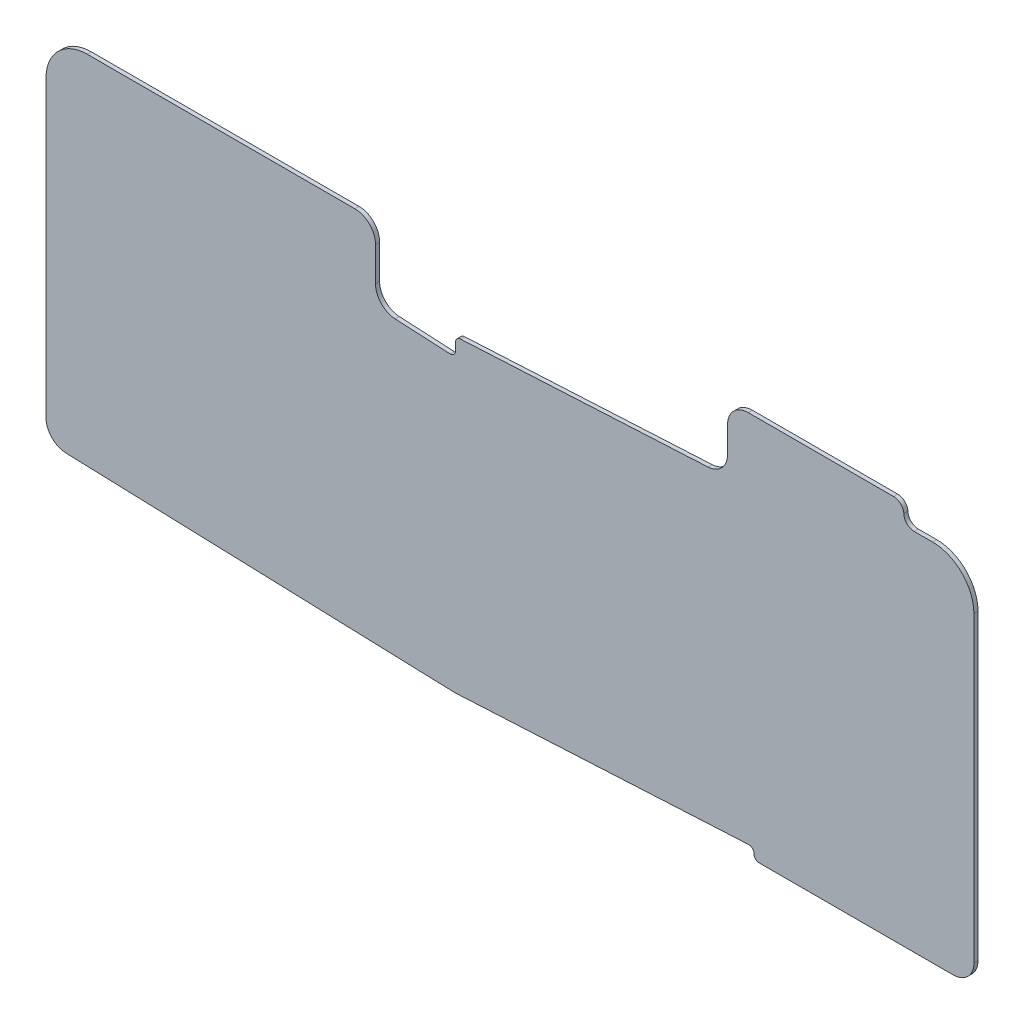
ISO-10303-21;
HEADER;
FILE_DESCRIPTION(('STEP AP214'),'2;1');
FILE_NAME('part.step','',(''),(''),'','','');
FILE_SCHEMA(('AUTOMOTIVE_DESIGN { 1 0 10303 214 1 1 1 1 }'));
ENDSEC;
DATA;
#1=APPLICATION_CONTEXT('core data for automotive mechanical design processes');
#2=APPLICATION_PROTOCOL_DEFINITION('international standard','automotive_design',2000,#1);
#3=PRODUCT_CONTEXT('',#1,'mechanical');
#4=PRODUCT('Part','Part','',(#3));
#5=PRODUCT_RELATED_PRODUCT_CATEGORY('part','',(#4));
#6=PRODUCT_DEFINITION_FORMATION('','',#4);
#7=PRODUCT_DEFINITION_CONTEXT('part definition',#1,'design');
#8=PRODUCT_DEFINITION('design','',#6,#7);
#9=PRODUCT_DEFINITION_SHAPE('','',#8);
#10=(LENGTH_UNIT() NAMED_UNIT(*) SI_UNIT(.MILLI.,.METRE.));
#11=(NAMED_UNIT(*) PLANE_ANGLE_UNIT() SI_UNIT($,.RADIAN.));
#12=(NAMED_UNIT(*) SI_UNIT($,.STERADIAN.) SOLID_ANGLE_UNIT());
#13=UNCERTAINTY_MEASURE_WITH_UNIT(LENGTH_MEASURE(1.E-05),#10,'distance_accuracy_value','');
#14=(GEOMETRIC_REPRESENTATION_CONTEXT(3) GLOBAL_UNCERTAINTY_ASSIGNED_CONTEXT((#13)) GLOBAL_UNIT_ASSIGNED_CONTEXT((#10,
#11,#12)) REPRESENTATION_CONTEXT('',''));
#15=CARTESIAN_POINT('',(0.,0.,0.));
#16=DIRECTION('',(0.,0.,1.));
#17=DIRECTION('',(1.,0.,0.));
#18=AXIS2_PLACEMENT_3D('',#15,#16,#17);
#19=CARTESIAN_POINT('',(-142.754433684428,110.187089821095,1.6));
#20=DIRECTION('',(0.,0.,-1.));
#21=DIRECTION('',(-1.,0.,0.));
#22=AXIS2_PLACEMENT_3D('',#19,#20,#21);
#23=CYLINDRICAL_SURFACE('',#22,16.);
#24=CARTESIAN_POINT('',(-142.754433684428,110.187089821095,0.));
#25=DIRECTION('',(0.,0.,1.));
#26=DIRECTION('',(1.,0.,0.));
#27=AXIS2_PLACEMENT_3D('',#24,#25,#26);
#28=CIRCLE('',#27,16.);
#29=CARTESIAN_POINT('',(-142.754433684428,126.187089821095,0.));
#30=VERTEX_POINT('',#29);
#31=CARTESIAN_POINT('',(-158.754433684428,110.187089821095,0.));
#32=VERTEX_POINT('',#31);
#33=EDGE_CURVE('E261',#30,#32,#28,.T.);
#34=ORIENTED_EDGE('',*,*,#33,.T.);
#35=DIRECTION('',(0.,0.,-1.));
#36=VECTOR('',#35,1.);
#37=CARTESIAN_POINT('',(-158.754433684428,110.187089821095,1.6));
#38=LINE('',#37,#36);
#39=CARTESIAN_POINT('',(-158.754433684428,110.187089821095,1.6));
#40=VERTEX_POINT('',#39);
#41=EDGE_CURVE('E11',#40,#32,#38,.T.);
#42=ORIENTED_EDGE('',*,*,#41,.F.);
#43=CARTESIAN_POINT('',(-142.754433684428,110.187089821095,1.6));
#44=DIRECTION('',(0.,0.,1.));
#45=DIRECTION('',(1.,0.,0.));
#46=AXIS2_PLACEMENT_3D('',#43,#44,#45);
#47=CIRCLE('',#46,16.);
#48=CARTESIAN_POINT('',(-142.754433684428,126.187089821095,1.6));
#49=VERTEX_POINT('',#48);
#50=EDGE_CURVE('E320',#49,#40,#47,.T.);
#51=ORIENTED_EDGE('',*,*,#50,.F.);
#52=DIRECTION('',(0.,0.,-1.));
#53=VECTOR('',#52,1.);
#54=CARTESIAN_POINT('',(-142.754433684428,126.187089821095,1.6));
#55=LINE('',#54,#53);
#56=EDGE_CURVE('E257',#49,#30,#55,.T.);
#57=ORIENTED_EDGE('',*,*,#56,.T.);
#58=EDGE_LOOP('',(#34,#42,#51,#57));
#59=FACE_BOUND('',#58,.T.);
#60=ADVANCED_FACE('F33',(#59),#23,.T.);
#61=CARTESIAN_POINT('',(-158.754433684428,-3.86594712239483,1.6));
#62=DIRECTION('',(1.,0.,0.));
#63=DIRECTION('',(0.,0.,-1.));
#64=AXIS2_PLACEMENT_3D('',#61,#62,#63);
#65=PLANE('',#64);
#66=DIRECTION('',(0.,-1.,0.));
#67=VECTOR('',#66,1.);
#68=CARTESIAN_POINT('',(-158.754433684428,-3.86594712239483,0.));
#69=LINE('',#68,#67);
#70=CARTESIAN_POINT('',(-158.754433684428,-3.86594712239483,0.));
#71=VERTEX_POINT('',#70);
#72=EDGE_CURVE('E264',#32,#71,#69,.T.);
#73=ORIENTED_EDGE('',*,*,#72,.T.);
#74=DIRECTION('',(0.,0.,-1.));
#75=VECTOR('',#74,1.);
#76=CARTESIAN_POINT('',(-158.754433684428,-3.86594712239483,1.6));
#77=LINE('',#76,#75);
#78=CARTESIAN_POINT('',(-158.754433684428,-3.86594712239483,1.6));
#79=VERTEX_POINT('',#78);
#80=EDGE_CURVE('E41',#79,#71,#77,.T.);
#81=ORIENTED_EDGE('',*,*,#80,.F.);
#82=DIRECTION('',(0.,-1.,0.));
#83=VECTOR('',#82,1.);
#84=CARTESIAN_POINT('',(-158.754433684428,95.6798603196686,1.6));
#85=LINE('',#84,#83);
#86=EDGE_CURVE('E158',#40,#79,#85,.T.);
#87=ORIENTED_EDGE('',*,*,#86,.F.);
#88=ORIENTED_EDGE('',*,*,#41,.T.);
#89=EDGE_LOOP('',(#73,#81,#87,#88));
#90=FACE_BOUND('',#89,.T.);
#91=ADVANCED_FACE('F488',(#90),#65,.F.);
#92=CARTESIAN_POINT('',(-150.754433684427,-3.86594712239483,1.6));
#93=DIRECTION('',(0.,0.,-1.));
#94=DIRECTION('',(-1.,0.,0.));
#95=AXIS2_PLACEMENT_3D('',#92,#93,#94);
#96=CYLINDRICAL_SURFACE('',#95,8.00000000000003);
#97=CARTESIAN_POINT('',(-150.754433684427,-3.86594712239483,0.));
#98=DIRECTION('',(0.,0.,1.));
#99=DIRECTION('',(1.,0.,0.));
#100=AXIS2_PLACEMENT_3D('',#97,#98,#99);
#101=CIRCLE('',#100,8.00000000000003);
#102=CARTESIAN_POINT('',(-151.023233988295,-11.8614299969085,0.));
#103=VERTEX_POINT('',#102);
#104=EDGE_CURVE('E266',#71,#103,#101,.T.);
#105=ORIENTED_EDGE('',*,*,#104,.T.);
#106=DIRECTION('',(0.,0.,-1.));
#107=VECTOR('',#106,1.);
#108=CARTESIAN_POINT('',(-151.023233988295,-11.8614299969085,1.6));
#109=LINE('',#108,#107);
#110=CARTESIAN_POINT('',(-151.023233988295,-11.8614299969085,1.6));
#111=VERTEX_POINT('',#110);
#112=EDGE_CURVE('E393',#111,#103,#109,.T.);
#113=ORIENTED_EDGE('',*,*,#112,.F.);
#114=CARTESIAN_POINT('',(-150.754433684427,-3.86594712239483,1.6));
#115=DIRECTION('',(0.,0.,1.));
#116=DIRECTION('',(1.,0.,0.));
#117=AXIS2_PLACEMENT_3D('',#114,#115,#116);
#118=CIRCLE('',#117,8.00000000000003);
#119=EDGE_CURVE('E401',#79,#111,#118,.T.);
#120=ORIENTED_EDGE('',*,*,#119,.F.);
#121=ORIENTED_EDGE('',*,*,#80,.T.);
#122=EDGE_LOOP('',(#105,#113,#120,#121));
#123=FACE_BOUND('',#122,.T.);
#124=ADVANCED_FACE('F399',(#123),#96,.T.);
#125=CARTESIAN_POINT('',(-1.21955829942181,-16.8976828633825,1.6));
#126=DIRECTION('',(0.0336000379834171,0.999435359314204,0.));
#127=DIRECTION('',(-0.999435359314204,0.0336000379834171,0.));
#128=AXIS2_PLACEMENT_3D('',#125,#126,#127);
#129=PLANE('',#128);
#130=DIRECTION('',(0.999435359314205,-0.0336000379834171,0.));
#131=VECTOR('',#130,1.);
#132=CARTESIAN_POINT('',(-1.21955829942181,-16.8976828633825,0.));
#133=LINE('',#132,#131);
#134=CARTESIAN_POINT('',(-1.21955829942181,-16.8976828633825,0.));
#135=VERTEX_POINT('',#134);
#136=EDGE_CURVE('E268',#103,#135,#133,.T.);
#137=ORIENTED_EDGE('',*,*,#136,.T.);
#138=DIRECTION('',(0.,0.,-1.));
#139=VECTOR('',#138,1.);
#140=CARTESIAN_POINT('',(-1.21955829942181,-16.8976828633825,1.6));
#141=LINE('',#140,#139);
#142=CARTESIAN_POINT('',(-1.21955829942181,-16.8976828633825,1.6));
#143=VERTEX_POINT('',#142);
#144=EDGE_CURVE('E390',#143,#135,#141,.T.);
#145=ORIENTED_EDGE('',*,*,#144,.F.);
#146=DIRECTION('',(0.999435359314205,-0.0336000379834171,0.));
#147=VECTOR('',#146,1.);
#148=CARTESIAN_POINT('',(-1.21955829942181,-16.8976828633825,1.6));
#149=LINE('',#148,#147);
#150=EDGE_CURVE('E419',#111,#143,#149,.T.);
#151=ORIENTED_EDGE('',*,*,#150,.F.);
#152=ORIENTED_EDGE('',*,*,#112,.T.);
#153=EDGE_LOOP('',(#137,#145,#151,#152));
#154=FACE_BOUND('',#153,.T.);
#155=ADVANCED_FACE('F410',(#154),#129,.F.);
#156=CARTESIAN_POINT('',(-0.379557349835993,8.08820111947182,1.6));
#157=DIRECTION('',(0.,0.,-1.));
#158=DIRECTION('',(-1.,0.,0.));
#159=AXIS2_PLACEMENT_3D('',#156,#157,#158);
#160=CYLINDRICAL_SURFACE('',#159,24.9999999999992);
#161=CARTESIAN_POINT('',(-0.379557349835993,8.08820111947182,0.));
#162=DIRECTION('',(0.,0.,1.));
#163=DIRECTION('',(1.,0.,0.));
#164=AXIS2_PLACEMENT_3D('',#161,#162,#163);
#165=CIRCLE('',#164,24.9999999999992);
#166=CARTESIAN_POINT('',(0.928841556237103,-16.8775372493918,0.));
#167=VERTEX_POINT('',#166);
#168=EDGE_CURVE('E270',#135,#167,#165,.T.);
#169=ORIENTED_EDGE('',*,*,#168,.T.);
#170=DIRECTION('',(0.,0.,-1.));
#171=VECTOR('',#170,1.);
#172=CARTESIAN_POINT('',(0.928841556237103,-16.8775372493918,1.6));
#173=LINE('',#172,#171);
#174=CARTESIAN_POINT('',(0.928841556237103,-16.8775372493918,1.6));
#175=VERTEX_POINT('',#174);
#176=EDGE_CURVE('E387',#175,#167,#173,.T.);
#177=ORIENTED_EDGE('',*,*,#176,.F.);
#178=CARTESIAN_POINT('',(-0.379557349835993,8.08820111947182,1.6));
#179=DIRECTION('',(0.,0.,1.));
#180=DIRECTION('',(1.,0.,0.));
#181=AXIS2_PLACEMENT_3D('',#178,#179,#180);
#182=CIRCLE('',#181,24.9999999999992);
#183=EDGE_CURVE('E416',#143,#175,#182,.T.);
#184=ORIENTED_EDGE('',*,*,#183,.F.);
#185=ORIENTED_EDGE('',*,*,#144,.T.);
#186=EDGE_LOOP('',(#169,#177,#184,#185));
#187=FACE_BOUND('',#186,.T.);
#188=ADVANCED_FACE('F414',(#187),#160,.T.);
#189=CARTESIAN_POINT('',(113.646118630477,-10.9702750710999,1.6));
#190=DIRECTION('',(-0.0523359562429408,0.998629534754574,0.));
#191=DIRECTION('',(-0.998629534754574,-0.0523359562429408,0.));
#192=AXIS2_PLACEMENT_3D('',#189,#190,#191);
#193=PLANE('',#192);
#194=DIRECTION('',(0.998629534754574,0.0523359562429408,0.));
#195=VECTOR('',#194,1.);
#196=CARTESIAN_POINT('',(113.646118630477,-10.9702750710999,0.));
#197=LINE('',#196,#195);
#198=CARTESIAN_POINT('',(113.646118630477,-10.9702750710999,0.));
#199=VERTEX_POINT('',#198);
#200=EDGE_CURVE('E272',#167,#199,#197,.T.);
#201=ORIENTED_EDGE('',*,*,#200,.T.);
#202=DIRECTION('',(0.,0.,-1.));
#203=VECTOR('',#202,1.);
#204=CARTESIAN_POINT('',(113.646118630477,-10.9702750710999,1.6));
#205=LINE('',#204,#203);
#206=CARTESIAN_POINT('',(113.646118630477,-10.9702750710999,1.6));
#207=VERTEX_POINT('',#206);
#208=EDGE_CURVE('E384',#207,#199,#205,.T.);
#209=ORIENTED_EDGE('',*,*,#208,.F.);
#210=DIRECTION('',(0.998629534754574,0.0523359562429408,0.));
#211=VECTOR('',#210,1.);
#212=CARTESIAN_POINT('',(113.646118630477,-10.9702750710999,1.6));
#213=LINE('',#212,#211);
#214=EDGE_CURVE('E418',#175,#207,#213,.T.);
#215=ORIENTED_EDGE('',*,*,#214,.F.);
#216=ORIENTED_EDGE('',*,*,#176,.T.);
#217=EDGE_LOOP('',(#201,#209,#215,#216));
#218=FACE_BOUND('',#217,.T.);
#219=ADVANCED_FACE('F501',(#218),#193,.F.);
#220=CARTESIAN_POINT('',(113.750790542963,-12.9675341406091,1.6));
#221=DIRECTION('',(0.,0.,-1.));
#222=DIRECTION('',(-1.,0.,0.));
#223=AXIS2_PLACEMENT_3D('',#220,#221,#222);
#224=CYLINDRICAL_SURFACE('',#223,1.99999999999997);
#225=CARTESIAN_POINT('',(113.750790542963,-12.9675341406091,0.));
#226=DIRECTION('',(0.,0.,-1.));
#227=DIRECTION('',(1.,0.,0.));
#228=AXIS2_PLACEMENT_3D('',#225,#226,#227);
#229=CIRCLE('',#228,1.99999999999997);
#230=CARTESIAN_POINT('',(115.750790542963,-12.967534140609,0.));
#231=VERTEX_POINT('',#230);
#232=EDGE_CURVE('E274',#199,#231,#229,.T.);
#233=ORIENTED_EDGE('',*,*,#232,.T.);
#234=DIRECTION('',(0.,0.,-1.));
#235=VECTOR('',#234,1.);
#236=CARTESIAN_POINT('',(115.750790542963,-12.967534140609,1.6));
#237=LINE('',#236,#235);
#238=CARTESIAN_POINT('',(115.750790542963,-12.967534140609,1.6));
#239=VERTEX_POINT('',#238);
#240=EDGE_CURVE('E381',#239,#231,#237,.T.);
#241=ORIENTED_EDGE('',*,*,#240,.F.);
#242=CARTESIAN_POINT('',(113.750790542963,-12.9675341406091,1.6));
#243=DIRECTION('',(0.,0.,-1.));
#244=DIRECTION('',(1.,0.,0.));
#245=AXIS2_PLACEMENT_3D('',#242,#243,#244);
#246=CIRCLE('',#245,1.99999999999997);
#247=EDGE_CURVE('E421',#207,#239,#246,.T.);
#248=ORIENTED_EDGE('',*,*,#247,.F.);
#249=ORIENTED_EDGE('',*,*,#208,.T.);
#250=EDGE_LOOP('',(#233,#241,#248,#249));
#251=FACE_BOUND('',#250,.T.);
#252=ADVANCED_FACE('F504',(#251),#224,.F.);
#253=CARTESIAN_POINT('',(115.750790542963,-13.0915973463914,1.6));
#254=DIRECTION('',(1.,0.,0.));
#255=DIRECTION('',(0.,0.,-1.));
#256=AXIS2_PLACEMENT_3D('',#253,#254,#255);
#257=PLANE('',#256);
#258=DIRECTION('',(0.,-1.,0.));
#259=VECTOR('',#258,1.);
#260=CARTESIAN_POINT('',(115.750790542963,-13.0915973463914,0.));
#261=LINE('',#260,#259);
#262=CARTESIAN_POINT('',(115.750790542963,-13.0915973463914,0.));
#263=VERTEX_POINT('',#262);
#264=EDGE_CURVE('E276',#231,#263,#261,.T.);
#265=ORIENTED_EDGE('',*,*,#264,.T.);
#266=DIRECTION('',(0.,0.,-1.));
#267=VECTOR('',#266,1.);
#268=CARTESIAN_POINT('',(115.750790542963,-13.0915973463914,1.6));
#269=LINE('',#268,#267);
#270=CARTESIAN_POINT('',(115.750790542963,-13.0915973463914,1.6));
#271=VERTEX_POINT('',#270);
#272=EDGE_CURVE('E378',#271,#263,#269,.T.);
#273=ORIENTED_EDGE('',*,*,#272,.F.);
#274=DIRECTION('',(0.,-1.,0.));
#275=VECTOR('',#274,1.);
#276=CARTESIAN_POINT('',(115.750790542963,-13.0915973463914,1.6));
#277=LINE('',#276,#275);
#278=EDGE_CURVE('E427',#239,#271,#277,.T.);
#279=ORIENTED_EDGE('',*,*,#278,.F.);
#280=ORIENTED_EDGE('',*,*,#240,.T.);
#281=EDGE_LOOP('',(#265,#273,#279,#280));
#282=FACE_BOUND('',#281,.T.);
#283=ADVANCED_FACE('F508',(#282),#257,.F.);
#284=CARTESIAN_POINT('',(117.750790542963,-13.0915973463914,1.6));
#285=DIRECTION('',(0.,0.,-1.));
#286=DIRECTION('',(-1.,0.,0.));
#287=AXIS2_PLACEMENT_3D('',#284,#285,#286);
#288=CYLINDRICAL_SURFACE('',#287,2.00000000000005);
#289=CARTESIAN_POINT('',(117.750790542963,-13.0915973463914,0.));
#290=DIRECTION('',(0.,0.,1.));
#291=DIRECTION('',(1.,0.,0.));
#292=AXIS2_PLACEMENT_3D('',#289,#290,#291);
#293=CIRCLE('',#292,2.00000000000005);
#294=CARTESIAN_POINT('',(117.750790542963,-15.0915973463914,0.));
#295=VERTEX_POINT('',#294);
#296=EDGE_CURVE('E278',#263,#295,#293,.T.);
#297=ORIENTED_EDGE('',*,*,#296,.T.);
#298=DIRECTION('',(0.,0.,-1.));
#299=VECTOR('',#298,1.);
#300=CARTESIAN_POINT('',(117.750790542963,-15.0915973463914,1.6));
#301=LINE('',#300,#299);
#302=CARTESIAN_POINT('',(117.750790542963,-15.0915973463914,1.6));
#303=VERTEX_POINT('',#302);
#304=EDGE_CURVE('E375',#303,#295,#301,.T.);
#305=ORIENTED_EDGE('',*,*,#304,.F.);
#306=CARTESIAN_POINT('',(117.750790542963,-13.0915973463914,1.6));
#307=DIRECTION('',(0.,0.,1.));
#308=DIRECTION('',(1.,0.,0.));
#309=AXIS2_PLACEMENT_3D('',#306,#307,#308);
#310=CIRCLE('',#309,2.00000000000005);
#311=EDGE_CURVE('E429',#271,#303,#310,.T.);
#312=ORIENTED_EDGE('',*,*,#311,.F.);
#313=ORIENTED_EDGE('',*,*,#272,.T.);
#314=EDGE_LOOP('',(#297,#305,#312,#313));
#315=FACE_BOUND('',#314,.T.);
#316=ADVANCED_FACE('F512',(#315),#288,.T.);
#317=CARTESIAN_POINT('',(193.,-15.0915973463915,1.6));
#318=DIRECTION('',(0.,1.,0.));
#319=DIRECTION('',(-1.,0.,0.));
#320=AXIS2_PLACEMENT_3D('',#317,#318,#319);
#321=PLANE('',#320);
#322=DIRECTION('',(1.,0.,0.));
#323=VECTOR('',#322,1.);
#324=CARTESIAN_POINT('',(193.,-15.0915973463915,0.));
#325=LINE('',#324,#323);
#326=CARTESIAN_POINT('',(193.,-15.0915973463915,0.));
#327=VERTEX_POINT('',#326);
#328=EDGE_CURVE('E280',#295,#327,#325,.T.);
#329=ORIENTED_EDGE('',*,*,#328,.T.);
#330=DIRECTION('',(0.,0.,-1.));
#331=VECTOR('',#330,1.);
#332=CARTESIAN_POINT('',(193.,-15.0915973463915,1.6));
#333=LINE('',#332,#331);
#334=CARTESIAN_POINT('',(193.,-15.0915973463915,1.6));
#335=VERTEX_POINT('',#334);
#336=EDGE_CURVE('E372',#335,#327,#333,.T.);
#337=ORIENTED_EDGE('',*,*,#336,.F.);
#338=DIRECTION('',(1.,0.,0.));
#339=VECTOR('',#338,1.);
#340=CARTESIAN_POINT('',(193.,-15.0915973463915,1.6));
#341=LINE('',#340,#339);
#342=EDGE_CURVE('E431',#303,#335,#341,.T.);
#343=ORIENTED_EDGE('',*,*,#342,.F.);
#344=ORIENTED_EDGE('',*,*,#304,.T.);
#345=EDGE_LOOP('',(#329,#337,#343,#344));
#346=FACE_BOUND('',#345,.T.);
#347=ADVANCED_FACE('F516',(#346),#321,.F.);
#348=CARTESIAN_POINT('',(193.,-7.09159734639147,1.6));
#349=DIRECTION('',(0.,0.,-1.));
#350=DIRECTION('',(-1.,0.,0.));
#351=AXIS2_PLACEMENT_3D('',#348,#349,#350);
#352=CYLINDRICAL_SURFACE('',#351,8.00000000000005);
#353=CARTESIAN_POINT('',(193.,-7.09159734639147,0.));
#354=DIRECTION('',(0.,0.,1.));
#355=DIRECTION('',(1.,0.,0.));
#356=AXIS2_PLACEMENT_3D('',#353,#354,#355);
#357=CIRCLE('',#356,8.00000000000005);
#358=CARTESIAN_POINT('',(201.,-7.09159734639144,0.));
#359=VERTEX_POINT('',#358);
#360=EDGE_CURVE('E282',#327,#359,#357,.T.);
#361=ORIENTED_EDGE('',*,*,#360,.T.);
#362=DIRECTION('',(0.,0.,-1.));
#363=VECTOR('',#362,1.);
#364=CARTESIAN_POINT('',(201.,-7.09159734639144,1.6));
#365=LINE('',#364,#363);
#366=CARTESIAN_POINT('',(201.,-7.09159734639144,1.6));
#367=VERTEX_POINT('',#366);
#368=EDGE_CURVE('E369',#367,#359,#365,.T.);
#369=ORIENTED_EDGE('',*,*,#368,.F.);
#370=CARTESIAN_POINT('',(193.,-7.09159734639147,1.6));
#371=DIRECTION('',(0.,0.,1.));
#372=DIRECTION('',(1.,0.,0.));
#373=AXIS2_PLACEMENT_3D('',#370,#371,#372);
#374=CIRCLE('',#373,8.00000000000005);
#375=EDGE_CURVE('E433',#335,#367,#374,.T.);
#376=ORIENTED_EDGE('',*,*,#375,.F.);
#377=ORIENTED_EDGE('',*,*,#336,.T.);
#378=EDGE_LOOP('',(#361,#369,#376,#377));
#379=FACE_BOUND('',#378,.T.);
#380=ADVANCED_FACE('F520',(#379),#352,.T.);
#381=CARTESIAN_POINT('',(201.,97.8938566348198,1.6));
#382=DIRECTION('',(-1.,0.,0.));
#383=DIRECTION('',(0.,0.,1.));
#384=AXIS2_PLACEMENT_3D('',#381,#382,#383);
#385=PLANE('',#384);
#386=DIRECTION('',(0.,1.,0.));
#387=VECTOR('',#386,1.);
#388=CARTESIAN_POINT('',(201.,97.8938566348198,0.));
#389=LINE('',#388,#387);
#390=CARTESIAN_POINT('',(201.,110.27653598152,0.));
#391=VERTEX_POINT('',#390);
#392=EDGE_CURVE('E285',#359,#391,#389,.T.);
#393=ORIENTED_EDGE('',*,*,#392,.T.);
#394=DIRECTION('',(0.,0.,-1.));
#395=VECTOR('',#394,1.);
#396=CARTESIAN_POINT('',(201.,110.27653598152,1.6));
#397=LINE('',#396,#395);
#398=CARTESIAN_POINT('',(201.,110.27653598152,1.6));
#399=VERTEX_POINT('',#398);
#400=EDGE_CURVE('E366',#399,#391,#397,.T.);
#401=ORIENTED_EDGE('',*,*,#400,.F.);
#402=DIRECTION('',(0.,1.,0.));
#403=VECTOR('',#402,1.);
#404=CARTESIAN_POINT('',(201.,97.8938566348198,1.6));
#405=LINE('',#404,#403);
#406=EDGE_CURVE('E435',#367,#399,#405,.T.);
#407=ORIENTED_EDGE('',*,*,#406,.F.);
#408=ORIENTED_EDGE('',*,*,#368,.T.);
#409=EDGE_LOOP('',(#393,#401,#407,#408));
#410=FACE_BOUND('',#409,.T.);
#411=ADVANCED_FACE('F524',(#410),#385,.F.);
#412=CARTESIAN_POINT('',(185.,110.27653598152,1.6));
#413=DIRECTION('',(0.,0.,-1.));
#414=DIRECTION('',(-1.,0.,0.));
#415=AXIS2_PLACEMENT_3D('',#412,#413,#414);
#416=CYLINDRICAL_SURFACE('',#415,16.);
#417=CARTESIAN_POINT('',(185.,110.27653598152,0.));
#418=DIRECTION('',(0.,0.,1.));
#419=DIRECTION('',(1.,0.,0.));
#420=AXIS2_PLACEMENT_3D('',#417,#418,#419);
#421=CIRCLE('',#420,16.);
#422=CARTESIAN_POINT('',(185.,126.27653598152,0.));
#423=VERTEX_POINT('',#422);
#424=EDGE_CURVE('E287',#391,#423,#421,.T.);
#425=ORIENTED_EDGE('',*,*,#424,.T.);
#426=DIRECTION('',(0.,0.,-1.));
#427=VECTOR('',#426,1.);
#428=CARTESIAN_POINT('',(185.,126.27653598152,1.6));
#429=LINE('',#428,#427);
#430=CARTESIAN_POINT('',(185.,126.27653598152,1.6));
#431=VERTEX_POINT('',#430);
#432=EDGE_CURVE('E363',#431,#423,#429,.T.);
#433=ORIENTED_EDGE('',*,*,#432,.F.);
#434=CARTESIAN_POINT('',(185.,110.27653598152,1.6));
#435=DIRECTION('',(0.,0.,1.));
#436=DIRECTION('',(1.,0.,0.));
#437=AXIS2_PLACEMENT_3D('',#434,#435,#436);
#438=CIRCLE('',#437,16.);
#439=EDGE_CURVE('E437',#399,#431,#438,.T.);
#440=ORIENTED_EDGE('',*,*,#439,.F.);
#441=ORIENTED_EDGE('',*,*,#400,.T.);
#442=EDGE_LOOP('',(#425,#433,#440,#441));
#443=FACE_BOUND('',#442,.T.);
#444=ADVANCED_FACE('F528',(#443),#416,.T.);
#445=CARTESIAN_POINT('',(185.,126.27653598152,1.6));
#446=DIRECTION('',(0.,-1.,0.));
#447=DIRECTION('',(0.,0.,-1.));
#448=AXIS2_PLACEMENT_3D('',#445,#446,#447);
#449=PLANE('',#448);
#450=DIRECTION('',(-1.,0.,0.));
#451=VECTOR('',#450,1.);
#452=CARTESIAN_POINT('',(185.,126.27653598152,0.));
#453=LINE('',#452,#451);
#454=CARTESIAN_POINT('',(177.851790542964,126.27653598152,0.));
#455=VERTEX_POINT('',#454);
#456=EDGE_CURVE('E289',#423,#455,#453,.T.);
#457=ORIENTED_EDGE('',*,*,#456,.T.);
#458=DIRECTION('',(0.,0.,-1.));
#459=VECTOR('',#458,1.);
#460=CARTESIAN_POINT('',(177.851790542964,126.27653598152,1.6));
#461=LINE('',#460,#459);
#462=CARTESIAN_POINT('',(177.851790542964,126.27653598152,1.6));
#463=VERTEX_POINT('',#462);
#464=EDGE_CURVE('E360',#463,#455,#461,.T.);
#465=ORIENTED_EDGE('',*,*,#464,.F.);
#466=DIRECTION('',(-1.,0.,0.));
#467=VECTOR('',#466,1.);
#468=CARTESIAN_POINT('',(185.,126.27653598152,1.6));
#469=LINE('',#468,#467);
#470=EDGE_CURVE('E439',#431,#463,#469,.T.);
#471=ORIENTED_EDGE('',*,*,#470,.F.);
#472=ORIENTED_EDGE('',*,*,#432,.T.);
#473=EDGE_LOOP('',(#457,#465,#471,#472));
#474=FACE_BOUND('',#473,.T.);
#475=ADVANCED_FACE('F532',(#474),#449,.F.);
#476=CARTESIAN_POINT('',(177.851790542964,130.27653598152,1.6));
#477=DIRECTION('',(0.,0.,-1.));
#478=DIRECTION('',(-1.,0.,0.));
#479=AXIS2_PLACEMENT_3D('',#476,#477,#478);
#480=CYLINDRICAL_SURFACE('',#479,4.);
#481=CARTESIAN_POINT('',(177.851790542964,130.27653598152,0.));
#482=DIRECTION('',(0.,0.,-1.));
#483=DIRECTION('',(1.,0.,0.));
#484=AXIS2_PLACEMENT_3D('',#481,#482,#483);
#485=CIRCLE('',#484,4.);
#486=CARTESIAN_POINT('',(173.851790542964,130.27653598152,0.));
#487=VERTEX_POINT('',#486);
#488=EDGE_CURVE('E291',#455,#487,#485,.T.);
#489=ORIENTED_EDGE('',*,*,#488,.T.);
#490=DIRECTION('',(0.,0.,-1.));
#491=VECTOR('',#490,1.);
#492=CARTESIAN_POINT('',(173.851790542964,130.27653598152,1.6));
#493=LINE('',#492,#491);
#494=CARTESIAN_POINT('',(173.851790542964,130.27653598152,1.6));
#495=VERTEX_POINT('',#494);
#496=EDGE_CURVE('E357',#495,#487,#493,.T.);
#497=ORIENTED_EDGE('',*,*,#496,.F.);
#498=CARTESIAN_POINT('',(177.851790542964,130.27653598152,1.6));
#499=DIRECTION('',(0.,0.,-1.));
#500=DIRECTION('',(1.,0.,0.));
#501=AXIS2_PLACEMENT_3D('',#498,#499,#500);
#502=CIRCLE('',#501,4.);
#503=EDGE_CURVE('E441',#463,#495,#502,.T.);
#504=ORIENTED_EDGE('',*,*,#503,.F.);
#505=ORIENTED_EDGE('',*,*,#464,.T.);
#506=EDGE_LOOP('',(#489,#497,#504,#505));
#507=FACE_BOUND('',#506,.T.);
#508=ADVANCED_FACE('F536',(#507),#480,.F.);
#509=CARTESIAN_POINT('',(173.851790542964,130.,1.6));
#510=DIRECTION('',(1.,0.,0.));
#511=DIRECTION('',(0.,0.,-1.));
#512=AXIS2_PLACEMENT_3D('',#509,#510,#511);
#513=PLANE('',#512);
#514=DIRECTION('',(0.,-1.,0.));
#515=VECTOR('',#514,1.);
#516=CARTESIAN_POINT('',(173.851790542964,130.,0.));
#517=LINE('',#516,#515);
#518=CARTESIAN_POINT('',(173.851790542964,130.,0.));
#519=VERTEX_POINT('',#518);
#520=EDGE_CURVE('E293',#487,#519,#517,.T.);
#521=ORIENTED_EDGE('',*,*,#520,.T.);
#522=DIRECTION('',(0.,0.,-1.));
#523=VECTOR('',#522,1.);
#524=CARTESIAN_POINT('',(173.851790542964,130.,1.6));
#525=LINE('',#524,#523);
#526=CARTESIAN_POINT('',(173.851790542964,130.,1.6));
#527=VERTEX_POINT('',#526);
#528=EDGE_CURVE('E354',#527,#519,#525,.T.);
#529=ORIENTED_EDGE('',*,*,#528,.F.);
#530=DIRECTION('',(0.,-1.,0.));
#531=VECTOR('',#530,1.);
#532=CARTESIAN_POINT('',(173.851790542964,130.,1.6));
#533=LINE('',#532,#531);
#534=EDGE_CURVE('E443',#495,#527,#533,.T.);
#535=ORIENTED_EDGE('',*,*,#534,.F.);
#536=ORIENTED_EDGE('',*,*,#496,.T.);
#537=EDGE_LOOP('',(#521,#529,#535,#536));
#538=FACE_BOUND('',#537,.T.);
#539=ADVANCED_FACE('F540',(#538),#513,.F.);
#540=CARTESIAN_POINT('',(169.851790542964,130.,1.6));
#541=DIRECTION('',(0.,0.,-1.));
#542=DIRECTION('',(-1.,0.,0.));
#543=AXIS2_PLACEMENT_3D('',#540,#541,#542);
#544=CYLINDRICAL_SURFACE('',#543,4.);
#545=CARTESIAN_POINT('',(169.851790542964,130.,0.));
#546=DIRECTION('',(0.,0.,1.));
#547=DIRECTION('',(1.,0.,0.));
#548=AXIS2_PLACEMENT_3D('',#545,#546,#547);
#549=CIRCLE('',#548,4.);
#550=CARTESIAN_POINT('',(169.851790542964,134.,0.));
#551=VERTEX_POINT('',#550);
#552=EDGE_CURVE('E295',#519,#551,#549,.T.);
#553=ORIENTED_EDGE('',*,*,#552,.T.);
#554=DIRECTION('',(0.,0.,-1.));
#555=VECTOR('',#554,1.);
#556=CARTESIAN_POINT('',(169.851790542964,134.,1.6));
#557=LINE('',#556,#555);
#558=CARTESIAN_POINT('',(169.851790542964,134.,1.6));
#559=VERTEX_POINT('',#558);
#560=EDGE_CURVE('E351',#559,#551,#557,.T.);
#561=ORIENTED_EDGE('',*,*,#560,.F.);
#562=CARTESIAN_POINT('',(169.851790542964,130.,1.6));
#563=DIRECTION('',(0.,0.,1.));
#564=DIRECTION('',(1.,0.,0.));
#565=AXIS2_PLACEMENT_3D('',#562,#563,#564);
#566=CIRCLE('',#565,4.);
#567=EDGE_CURVE('E445',#527,#559,#566,.T.);
#568=ORIENTED_EDGE('',*,*,#567,.F.);
#569=ORIENTED_EDGE('',*,*,#528,.T.);
#570=EDGE_LOOP('',(#553,#561,#568,#569));
#571=FACE_BOUND('',#570,.T.);
#572=ADVANCED_FACE('F544',(#571),#544,.T.);
#573=CARTESIAN_POINT('',(169.851790542964,134.,1.6));
#574=DIRECTION('',(0.,-1.,0.));
#575=DIRECTION('',(1.,0.,0.));
#576=AXIS2_PLACEMENT_3D('',#573,#574,#575);
#577=PLANE('',#576);
#578=DIRECTION('',(-1.,0.,0.));
#579=VECTOR('',#578,1.);
#580=CARTESIAN_POINT('',(169.851790542964,134.,0.));
#581=LINE('',#580,#579);
#582=CARTESIAN_POINT('',(113.5,134.,0.));
#583=VERTEX_POINT('',#582);
#584=EDGE_CURVE('E297',#551,#583,#581,.T.);
#585=ORIENTED_EDGE('',*,*,#584,.T.);
#586=DIRECTION('',(0.,0.,-1.));
#587=VECTOR('',#586,1.);
#588=CARTESIAN_POINT('',(113.5,134.,1.6));
#589=LINE('',#588,#587);
#590=CARTESIAN_POINT('',(113.5,134.,1.6));
#591=VERTEX_POINT('',#590);
#592=EDGE_CURVE('E348',#591,#583,#589,.T.);
#593=ORIENTED_EDGE('',*,*,#592,.F.);
#594=DIRECTION('',(-1.,0.,0.));
#595=VECTOR('',#594,1.);
#596=CARTESIAN_POINT('',(169.851790542964,134.,1.6));
#597=LINE('',#596,#595);
#598=EDGE_CURVE('E447',#559,#591,#597,.T.);
#599=ORIENTED_EDGE('',*,*,#598,.F.);
#600=ORIENTED_EDGE('',*,*,#560,.T.);
#601=EDGE_LOOP('',(#585,#593,#599,#600));
#602=FACE_BOUND('',#601,.T.);
#603=ADVANCED_FACE('F548',(#602),#577,.F.);
#604=CARTESIAN_POINT('',(113.5,126.,1.6));
#605=DIRECTION('',(0.,0.,-1.));
#606=DIRECTION('',(-1.,0.,0.));
#607=AXIS2_PLACEMENT_3D('',#604,#605,#606);
#608=CYLINDRICAL_SURFACE('',#607,8.00000000000001);
#609=CARTESIAN_POINT('',(113.5,126.,0.));
#610=DIRECTION('',(0.,0.,1.));
#611=DIRECTION('',(1.,0.,0.));
#612=AXIS2_PLACEMENT_3D('',#609,#610,#611);
#613=CIRCLE('',#612,8.00000000000001);
#614=CARTESIAN_POINT('',(105.5,126.,0.));
#615=VERTEX_POINT('',#614);
#616=EDGE_CURVE('E299',#583,#615,#613,.T.);
#617=ORIENTED_EDGE('',*,*,#616,.T.);
#618=DIRECTION('',(0.,0.,-1.));
#619=VECTOR('',#618,1.);
#620=CARTESIAN_POINT('',(105.5,126.,1.6));
#621=LINE('',#620,#619);
#622=CARTESIAN_POINT('',(105.5,126.,1.6));
#623=VERTEX_POINT('',#622);
#624=EDGE_CURVE('E345',#623,#615,#621,.T.);
#625=ORIENTED_EDGE('',*,*,#624,.F.);
#626=CARTESIAN_POINT('',(113.5,126.,1.6));
#627=DIRECTION('',(0.,0.,1.));
#628=DIRECTION('',(1.,0.,0.));
#629=AXIS2_PLACEMENT_3D('',#626,#627,#628);
#630=CIRCLE('',#629,8.00000000000001);
#631=EDGE_CURVE('E449',#591,#623,#630,.T.);
#632=ORIENTED_EDGE('',*,*,#631,.F.);
#633=ORIENTED_EDGE('',*,*,#592,.T.);
#634=EDGE_LOOP('',(#617,#625,#632,#633));
#635=FACE_BOUND('',#634,.T.);
#636=ADVANCED_FACE('F552',(#635),#608,.T.);
#637=CARTESIAN_POINT('',(105.5,126.,1.6));
#638=DIRECTION('',(1.,0.,0.));
#639=DIRECTION('',(0.,0.,-1.));
#640=AXIS2_PLACEMENT_3D('',#637,#638,#639);
#641=PLANE('',#640);
#642=DIRECTION('',(0.,-1.,0.));
#643=VECTOR('',#642,1.);
#644=CARTESIAN_POINT('',(105.5,126.,0.));
#645=LINE('',#644,#643);
#646=CARTESIAN_POINT('',(105.5,115.916360633249,0.));
#647=VERTEX_POINT('',#646);
#648=EDGE_CURVE('E301',#615,#647,#645,.T.);
#649=ORIENTED_EDGE('',*,*,#648,.T.);
#650=DIRECTION('',(0.,0.,-1.));
#651=VECTOR('',#650,1.);
#652=CARTESIAN_POINT('',(105.5,115.916360633249,1.6));
#653=LINE('',#652,#651);
#654=CARTESIAN_POINT('',(105.5,115.916360633249,1.6));
#655=VERTEX_POINT('',#654);
#656=EDGE_CURVE('E342',#655,#647,#653,.T.);
#657=ORIENTED_EDGE('',*,*,#656,.F.);
#658=DIRECTION('',(0.,-1.,0.));
#659=VECTOR('',#658,1.);
#660=CARTESIAN_POINT('',(105.5,126.,1.6));
#661=LINE('',#660,#659);
#662=EDGE_CURVE('E451',#623,#655,#661,.T.);
#663=ORIENTED_EDGE('',*,*,#662,.F.);
#664=ORIENTED_EDGE('',*,*,#624,.T.);
#665=EDGE_LOOP('',(#649,#657,#663,#664));
#666=FACE_BOUND('',#665,.T.);
#667=ADVANCED_FACE('F556',(#666),#641,.F.);
#668=CARTESIAN_POINT('',(97.5,115.916360633249,1.6));
#669=DIRECTION('',(0.,0.,-1.));
#670=DIRECTION('',(-1.,0.,0.));
#671=AXIS2_PLACEMENT_3D('',#668,#669,#670);
#672=CYLINDRICAL_SURFACE('',#671,7.99999999999999);
#673=CARTESIAN_POINT('',(97.5,115.916360633249,0.));
#674=DIRECTION('',(0.,0.,-1.));
#675=DIRECTION('',(1.,0.,0.));
#676=AXIS2_PLACEMENT_3D('',#673,#674,#675);
#677=CIRCLE('',#676,7.99999999999999);
#678=CARTESIAN_POINT('',(97.9186876499434,107.927324355213,0.));
#679=VERTEX_POINT('',#678);
#680=EDGE_CURVE('E303',#647,#679,#677,.T.);
#681=ORIENTED_EDGE('',*,*,#680,.T.);
#682=DIRECTION('',(0.,0.,-1.));
#683=VECTOR('',#682,1.);
#684=CARTESIAN_POINT('',(97.9186876499434,107.927324355213,1.6));
#685=LINE('',#684,#683);
#686=CARTESIAN_POINT('',(97.9186876499434,107.927324355213,1.6));
#687=VERTEX_POINT('',#686);
#688=EDGE_CURVE('E339',#687,#679,#685,.T.);
#689=ORIENTED_EDGE('',*,*,#688,.F.);
#690=CARTESIAN_POINT('',(97.5,115.916360633249,1.6));
#691=DIRECTION('',(0.,0.,-1.));
#692=DIRECTION('',(1.,0.,0.));
#693=AXIS2_PLACEMENT_3D('',#690,#691,#692);
#694=CIRCLE('',#693,7.99999999999999);
#695=EDGE_CURVE('E453',#655,#687,#694,.T.);
#696=ORIENTED_EDGE('',*,*,#695,.F.);
#697=ORIENTED_EDGE('',*,*,#656,.T.);
#698=EDGE_LOOP('',(#681,#689,#696,#697));
#699=FACE_BOUND('',#698,.T.);
#700=ADVANCED_FACE('F560',(#699),#672,.F.);
#701=CARTESIAN_POINT('',(1.89532808751414,102.89495332125,1.6));
#702=DIRECTION('',(0.0523359562429278,-0.998629534754575,0.));
#703=DIRECTION('',(0.998629534754575,0.0523359562429278,0.));
#704=AXIS2_PLACEMENT_3D('',#701,#702,#703);
#705=PLANE('',#704);
#706=DIRECTION('',(-0.998629534754575,-0.0523359562429278,0.));
#707=VECTOR('',#706,1.);
#708=CARTESIAN_POINT('',(1.89532808751414,102.89495332125,0.));
#709=LINE('',#708,#707);
#710=CARTESIAN_POINT('',(1.89532808751414,102.89495332125,0.));
#711=VERTEX_POINT('',#710);
#712=EDGE_CURVE('E305',#679,#711,#709,.T.);
#713=ORIENTED_EDGE('',*,*,#712,.T.);
#714=DIRECTION('',(0.,0.,-1.));
#715=VECTOR('',#714,1.);
#716=CARTESIAN_POINT('',(1.89532808751414,102.89495332125,1.6));
#717=LINE('',#716,#715);
#718=CARTESIAN_POINT('',(1.89532808751414,102.89495332125,1.6));
#719=VERTEX_POINT('',#718);
#720=EDGE_CURVE('E336',#719,#711,#717,.T.);
#721=ORIENTED_EDGE('',*,*,#720,.F.);
#722=DIRECTION('',(-0.998629534754575,-0.0523359562429278,0.));
#723=VECTOR('',#722,1.);
#724=CARTESIAN_POINT('',(1.89532808751414,102.89495332125,1.6));
#725=LINE('',#724,#723);
#726=EDGE_CURVE('E455',#687,#719,#725,.T.);
#727=ORIENTED_EDGE('',*,*,#726,.F.);
#728=ORIENTED_EDGE('',*,*,#688,.T.);
#729=EDGE_LOOP('',(#713,#721,#727,#728));
#730=FACE_BOUND('',#729,.T.);
#731=ADVANCED_FACE('F564',(#730),#705,.F.);
#732=CARTESIAN_POINT('',(2.,100.897694251741,1.6));
#733=DIRECTION('',(0.,0.,-1.));
#734=DIRECTION('',(-1.,0.,0.));
#735=AXIS2_PLACEMENT_3D('',#732,#733,#734);
#736=CYLINDRICAL_SURFACE('',#735,2.);
#737=CARTESIAN_POINT('',(2.,100.897694251741,0.));
#738=DIRECTION('',(0.,0.,1.));
#739=DIRECTION('',(1.,0.,0.));
#740=AXIS2_PLACEMENT_3D('',#737,#738,#739);
#741=CIRCLE('',#740,2.);
#742=CARTESIAN_POINT('',(0.,100.897694251741,0.));
#743=VERTEX_POINT('',#742);
#744=EDGE_CURVE('E307',#711,#743,#741,.T.);
#745=ORIENTED_EDGE('',*,*,#744,.T.);
#746=DIRECTION('',(0.,0.,-1.));
#747=VECTOR('',#746,1.);
#748=CARTESIAN_POINT('',(0.,100.897694251741,1.6));
#749=LINE('',#748,#747);
#750=CARTESIAN_POINT('',(0.,100.897694251741,1.6));
#751=VERTEX_POINT('',#750);
#752=EDGE_CURVE('E333',#751,#743,#749,.T.);
#753=ORIENTED_EDGE('',*,*,#752,.F.);
#754=CARTESIAN_POINT('',(2.,100.897694251741,1.6));
#755=DIRECTION('',(0.,0.,1.));
#756=DIRECTION('',(1.,0.,0.));
#757=AXIS2_PLACEMENT_3D('',#754,#755,#756);
#758=CIRCLE('',#757,2.);
#759=EDGE_CURVE('E457',#719,#751,#758,.T.);
#760=ORIENTED_EDGE('',*,*,#759,.F.);
#761=ORIENTED_EDGE('',*,*,#720,.T.);
#762=EDGE_LOOP('',(#745,#753,#760,#761));
#763=FACE_BOUND('',#762,.T.);
#764=ADVANCED_FACE('F568',(#763),#736,.T.);
#765=CARTESIAN_POINT('',(0.,97.8976942517382,1.6));
#766=DIRECTION('',(1.,0.,0.));
#767=DIRECTION('',(0.,0.,-1.));
#768=AXIS2_PLACEMENT_3D('',#765,#766,#767);
#769=PLANE('',#768);
#770=DIRECTION('',(0.,-1.,0.));
#771=VECTOR('',#770,1.);
#772=CARTESIAN_POINT('',(0.,97.8976942517382,0.));
#773=LINE('',#772,#771);
#774=CARTESIAN_POINT('',(0.,97.8976942517382,0.));
#775=VERTEX_POINT('',#774);
#776=EDGE_CURVE('E309',#743,#775,#773,.T.);
#777=ORIENTED_EDGE('',*,*,#776,.T.);
#778=DIRECTION('',(0.,0.,-1.));
#779=VECTOR('',#778,1.);
#780=CARTESIAN_POINT('',(0.,97.8976942517382,1.6));
#781=LINE('',#780,#779);
#782=CARTESIAN_POINT('',(0.,97.8976942517382,1.6));
#783=VERTEX_POINT('',#782);
#784=EDGE_CURVE('E330',#783,#775,#781,.T.);
#785=ORIENTED_EDGE('',*,*,#784,.F.);
#786=DIRECTION('',(0.,-1.,0.));
#787=VECTOR('',#786,1.);
#788=CARTESIAN_POINT('',(0.,97.8976942517382,1.6));
#789=LINE('',#788,#787);
#790=EDGE_CURVE('E459',#751,#783,#789,.T.);
#791=ORIENTED_EDGE('',*,*,#790,.F.);
#792=ORIENTED_EDGE('',*,*,#752,.T.);
#793=EDGE_LOOP('',(#777,#785,#791,#792));
#794=FACE_BOUND('',#793,.T.);
#795=ADVANCED_FACE('F572',(#794),#769,.F.);
#796=CARTESIAN_POINT('',(-2.,97.8976942517382,1.6));
#797=DIRECTION('',(0.,0.,-1.));
#798=DIRECTION('',(-1.,0.,0.));
#799=AXIS2_PLACEMENT_3D('',#796,#797,#798);
#800=CYLINDRICAL_SURFACE('',#799,2.);
#801=CARTESIAN_POINT('',(-2.,97.8976942517382,0.));
#802=DIRECTION('',(0.,0.,-1.));
#803=DIRECTION('',(1.,0.,0.));
#804=AXIS2_PLACEMENT_3D('',#801,#802,#803);
#805=CIRCLE('',#804,2.);
#806=CARTESIAN_POINT('',(-2.10467191248592,95.900435182229,0.));
#807=VERTEX_POINT('',#806);
#808=EDGE_CURVE('E311',#775,#807,#805,.T.);
#809=ORIENTED_EDGE('',*,*,#808,.T.);
#810=DIRECTION('',(0.,0.,-1.));
#811=VECTOR('',#810,1.);
#812=CARTESIAN_POINT('',(-2.10467191248592,95.900435182229,1.6));
#813=LINE('',#812,#811);
#814=CARTESIAN_POINT('',(-2.10467191248592,95.900435182229,1.6));
#815=VERTEX_POINT('',#814);
#816=EDGE_CURVE('E327',#815,#807,#813,.T.);
#817=ORIENTED_EDGE('',*,*,#816,.F.);
#818=CARTESIAN_POINT('',(-2.,97.8976942517382,1.6));
#819=DIRECTION('',(0.,0.,-1.));
#820=DIRECTION('',(1.,0.,0.));
#821=AXIS2_PLACEMENT_3D('',#818,#819,#820);
#822=CIRCLE('',#821,2.);
#823=EDGE_CURVE('E461',#783,#815,#822,.T.);
#824=ORIENTED_EDGE('',*,*,#823,.F.);
#825=ORIENTED_EDGE('',*,*,#784,.T.);
#826=EDGE_LOOP('',(#809,#817,#824,#825));
#827=FACE_BOUND('',#826,.T.);
#828=ADVANCED_FACE('F576',(#827),#800,.F.);
#829=CARTESIAN_POINT('',(-23.4186876499437,97.0174554146334,1.6));
#830=DIRECTION('',(-0.052335956242962,-0.998629534754573,0.));
#831=DIRECTION('',(0.998629534754573,-0.052335956242962,0.));
#832=AXIS2_PLACEMENT_3D('',#829,#830,#831);
#833=PLANE('',#832);
#834=DIRECTION('',(-0.998629534754573,0.052335956242962,0.));
#835=VECTOR('',#834,1.);
#836=CARTESIAN_POINT('',(-23.4186876499437,97.0174554146334,0.));
#837=LINE('',#836,#835);
#838=CARTESIAN_POINT('',(-23.4186876499437,97.0174554146334,0.));
#839=VERTEX_POINT('',#838);
#840=EDGE_CURVE('E313',#807,#839,#837,.T.);
#841=ORIENTED_EDGE('',*,*,#840,.T.);
#842=DIRECTION('',(0.,0.,-1.));
#843=VECTOR('',#842,1.);
#844=CARTESIAN_POINT('',(-23.4186876499437,97.0174554146334,1.6));
#845=LINE('',#844,#843);
#846=CARTESIAN_POINT('',(-23.4186876499437,97.0174554146334,1.6));
#847=VERTEX_POINT('',#846);
#848=EDGE_CURVE('E324',#847,#839,#845,.T.);
#849=ORIENTED_EDGE('',*,*,#848,.F.);
#850=DIRECTION('',(-0.998629534754573,0.052335956242962,0.));
#851=VECTOR('',#850,1.);
#852=CARTESIAN_POINT('',(-23.4186876499437,97.0174554146334,1.6));
#853=LINE('',#852,#851);
#854=EDGE_CURVE('E463',#815,#847,#853,.T.);
#855=ORIENTED_EDGE('',*,*,#854,.F.);
#856=ORIENTED_EDGE('',*,*,#816,.T.);
#857=EDGE_LOOP('',(#841,#849,#855,#856));
#858=FACE_BOUND('',#857,.T.);
#859=ADVANCED_FACE('F469',(#858),#833,.F.);
#860=CARTESIAN_POINT('',(-23.,105.00649169267,1.6));
#861=DIRECTION('',(0.,0.,-1.));
#862=DIRECTION('',(-1.,0.,0.));
#863=AXIS2_PLACEMENT_3D('',#860,#861,#862);
#864=CYLINDRICAL_SURFACE('',#863,7.99999999999999);
#865=CARTESIAN_POINT('',(-23.,105.00649169267,0.));
#866=DIRECTION('',(0.,0.,-1.));
#867=DIRECTION('',(1.,0.,0.));
#868=AXIS2_PLACEMENT_3D('',#865,#866,#867);
#869=CIRCLE('',#868,7.99999999999999);
#870=CARTESIAN_POINT('',(-31.,105.00649169267,0.));
#871=VERTEX_POINT('',#870);
#872=EDGE_CURVE('E315',#839,#871,#869,.T.);
#873=ORIENTED_EDGE('',*,*,#872,.T.);
#874=DIRECTION('',(0.,0.,-1.));
#875=VECTOR('',#874,1.);
#876=CARTESIAN_POINT('',(-31.,105.00649169267,1.6));
#877=LINE('',#876,#875);
#878=CARTESIAN_POINT('',(-31.,105.00649169267,1.6));
#879=VERTEX_POINT('',#878);
#880=EDGE_CURVE('E252',#879,#871,#877,.T.);
#881=ORIENTED_EDGE('',*,*,#880,.F.);
#882=CARTESIAN_POINT('',(-23.,105.00649169267,1.6));
#883=DIRECTION('',(0.,0.,-1.));
#884=DIRECTION('',(1.,0.,0.));
#885=AXIS2_PLACEMENT_3D('',#882,#883,#884);
#886=CIRCLE('',#885,7.99999999999999);
#887=EDGE_CURVE('E243',#847,#879,#886,.T.);
#888=ORIENTED_EDGE('',*,*,#887,.F.);
#889=ORIENTED_EDGE('',*,*,#848,.T.);
#890=EDGE_LOOP('',(#873,#881,#888,#889));
#891=FACE_BOUND('',#890,.T.);
#892=ADVANCED_FACE('F473',(#891),#864,.F.);
#893=CARTESIAN_POINT('',(-31.,105.00649169267,1.6));
#894=DIRECTION('',(-1.,0.,0.));
#895=DIRECTION('',(0.,0.,1.));
#896=AXIS2_PLACEMENT_3D('',#893,#894,#895);
#897=PLANE('',#896);
#898=DIRECTION('',(0.,1.,0.));
#899=VECTOR('',#898,1.);
#900=CARTESIAN_POINT('',(-31.,105.00649169267,0.));
#901=LINE('',#900,#899);
#902=CARTESIAN_POINT('',(-31.,118.187089821095,0.));
#903=VERTEX_POINT('',#902);
#904=EDGE_CURVE('E251',#871,#903,#901,.T.);
#905=ORIENTED_EDGE('',*,*,#904,.T.);
#906=DIRECTION('',(0.,0.,-1.));
#907=VECTOR('',#906,1.);
#908=CARTESIAN_POINT('',(-31.,118.187089821095,1.6));
#909=LINE('',#908,#907);
#910=CARTESIAN_POINT('',(-31.,118.187089821095,1.6));
#911=VERTEX_POINT('',#910);
#912=EDGE_CURVE('E248',#911,#903,#909,.T.);
#913=ORIENTED_EDGE('',*,*,#912,.F.);
#914=DIRECTION('',(0.,1.,0.));
#915=VECTOR('',#914,1.);
#916=CARTESIAN_POINT('',(-31.,105.00649169267,1.6));
#917=LINE('',#916,#915);
#918=EDGE_CURVE('E237',#879,#911,#917,.T.);
#919=ORIENTED_EDGE('',*,*,#918,.F.);
#920=ORIENTED_EDGE('',*,*,#880,.T.);
#921=EDGE_LOOP('',(#905,#913,#919,#920));
#922=FACE_BOUND('',#921,.T.);
#923=ADVANCED_FACE('F249',(#922),#897,.F.);
#924=CARTESIAN_POINT('',(-39.,118.187089821095,1.6));
#925=DIRECTION('',(0.,0.,-1.));
#926=DIRECTION('',(-1.,0.,0.));
#927=AXIS2_PLACEMENT_3D('',#924,#925,#926);
#928=CYLINDRICAL_SURFACE('',#927,8.00000000000001);
#929=CARTESIAN_POINT('',(-39.,118.187089821095,0.));
#930=DIRECTION('',(0.,0.,1.));
#931=DIRECTION('',(1.,0.,0.));
#932=AXIS2_PLACEMENT_3D('',#929,#930,#931);
#933=CIRCLE('',#932,8.00000000000001);
#934=CARTESIAN_POINT('',(-39.,126.187089821095,0.));
#935=VERTEX_POINT('',#934);
#936=EDGE_CURVE('E144',#903,#935,#933,.T.);
#937=ORIENTED_EDGE('',*,*,#936,.T.);
#938=DIRECTION('',(0.,0.,-1.));
#939=VECTOR('',#938,1.);
#940=CARTESIAN_POINT('',(-39.,126.187089821095,1.6));
#941=LINE('',#940,#939);
#942=CARTESIAN_POINT('',(-39.,126.187089821095,1.6));
#943=VERTEX_POINT('',#942);
#944=EDGE_CURVE('E253',#943,#935,#941,.T.);
#945=ORIENTED_EDGE('',*,*,#944,.F.);
#946=CARTESIAN_POINT('',(-39.,118.187089821095,1.6));
#947=DIRECTION('',(0.,0.,1.));
#948=DIRECTION('',(1.,0.,0.));
#949=AXIS2_PLACEMENT_3D('',#946,#947,#948);
#950=CIRCLE('',#949,8.00000000000001);
#951=EDGE_CURVE('E241',#911,#943,#950,.T.);
#952=ORIENTED_EDGE('',*,*,#951,.F.);
#953=ORIENTED_EDGE('',*,*,#912,.T.);
#954=EDGE_LOOP('',(#937,#945,#952,#953));
#955=FACE_BOUND('',#954,.T.);
#956=ADVANCED_FACE('F255',(#955),#928,.T.);
#957=CARTESIAN_POINT('',(-142.754433684428,126.187089821095,1.6));
#958=DIRECTION('',(0.,-1.,0.));
#959=DIRECTION('',(0.,0.,-1.));
#960=AXIS2_PLACEMENT_3D('',#957,#958,#959);
#961=PLANE('',#960);
#962=DIRECTION('',(-1.,0.,0.));
#963=VECTOR('',#962,1.);
#964=CARTESIAN_POINT('',(-142.754433684428,126.187089821095,0.));
#965=LINE('',#964,#963);
#966=EDGE_CURVE('E150',#935,#30,#965,.T.);
#967=ORIENTED_EDGE('',*,*,#966,.T.);
#968=ORIENTED_EDGE('',*,*,#56,.F.);
#969=DIRECTION('',(-1.,0.,0.));
#970=VECTOR('',#969,1.);
#971=CARTESIAN_POINT('',(-142.754433684428,126.187089821095,1.6));
#972=LINE('',#971,#970);
#973=EDGE_CURVE('E49',#943,#49,#972,.T.);
#974=ORIENTED_EDGE('',*,*,#973,.F.);
#975=ORIENTED_EDGE('',*,*,#944,.T.);
#976=EDGE_LOOP('',(#967,#968,#974,#975));
#977=FACE_BOUND('',#976,.T.);
#978=ADVANCED_FACE('F477',(#977),#961,.F.);
#979=CARTESIAN_POINT('',(-142.754433684428,110.187089821095,1.6));
#980=DIRECTION('',(0.,0.,1.));
#981=DIRECTION('',(1.,0.,0.));
#982=AXIS2_PLACEMENT_3D('',#979,#980,#981);
#983=PLANE('',#982);
#984=ORIENTED_EDGE('',*,*,#50,.T.);
#985=ORIENTED_EDGE('',*,*,#86,.T.);
#986=ORIENTED_EDGE('',*,*,#119,.T.);
#987=ORIENTED_EDGE('',*,*,#150,.T.);
#988=ORIENTED_EDGE('',*,*,#183,.T.);
#989=ORIENTED_EDGE('',*,*,#214,.T.);
#990=ORIENTED_EDGE('',*,*,#247,.T.);
#991=ORIENTED_EDGE('',*,*,#278,.T.);
#992=ORIENTED_EDGE('',*,*,#311,.T.);
#993=ORIENTED_EDGE('',*,*,#342,.T.);
#994=ORIENTED_EDGE('',*,*,#375,.T.);
#995=ORIENTED_EDGE('',*,*,#406,.T.);
#996=ORIENTED_EDGE('',*,*,#439,.T.);
#997=ORIENTED_EDGE('',*,*,#470,.T.);
#998=ORIENTED_EDGE('',*,*,#503,.T.);
#999=ORIENTED_EDGE('',*,*,#534,.T.);
#1000=ORIENTED_EDGE('',*,*,#567,.T.);
#1001=ORIENTED_EDGE('',*,*,#598,.T.);
#1002=ORIENTED_EDGE('',*,*,#631,.T.);
#1003=ORIENTED_EDGE('',*,*,#662,.T.);
#1004=ORIENTED_EDGE('',*,*,#695,.T.);
#1005=ORIENTED_EDGE('',*,*,#726,.T.);
#1006=ORIENTED_EDGE('',*,*,#759,.T.);
#1007=ORIENTED_EDGE('',*,*,#790,.T.);
#1008=ORIENTED_EDGE('',*,*,#823,.T.);
#1009=ORIENTED_EDGE('',*,*,#854,.T.);
#1010=ORIENTED_EDGE('',*,*,#887,.T.);
#1011=ORIENTED_EDGE('',*,*,#918,.T.);
#1012=ORIENTED_EDGE('',*,*,#951,.T.);
#1013=ORIENTED_EDGE('',*,*,#973,.T.);
#1014=EDGE_LOOP('',(#984,#985,#986,#987,#988,#989,#990,#991,#992,#993,#994,#995,#996,#997,#998,
#999,#1000,#1001,#1002,#1003,#1004,#1005,#1006,#1007,#1008,#1009,#1010,#1011,#1012,#1013));
#1015=FACE_BOUND('',#1014,.T.);
#1016=ADVANCED_FACE('F239',(#1015),#983,.T.);
#1017=CARTESIAN_POINT('',(-142.754433684428,110.187089821095,0.));
#1018=DIRECTION('',(0.,0.,1.));
#1019=DIRECTION('',(1.,0.,0.));
#1020=AXIS2_PLACEMENT_3D('',#1017,#1018,#1019);
#1021=PLANE('',#1020);
#1022=ORIENTED_EDGE('',*,*,#33,.F.);
#1023=ORIENTED_EDGE('',*,*,#966,.F.);
#1024=ORIENTED_EDGE('',*,*,#936,.F.);
#1025=ORIENTED_EDGE('',*,*,#904,.F.);
#1026=ORIENTED_EDGE('',*,*,#872,.F.);
#1027=ORIENTED_EDGE('',*,*,#840,.F.);
#1028=ORIENTED_EDGE('',*,*,#808,.F.);
#1029=ORIENTED_EDGE('',*,*,#776,.F.);
#1030=ORIENTED_EDGE('',*,*,#744,.F.);
#1031=ORIENTED_EDGE('',*,*,#712,.F.);
#1032=ORIENTED_EDGE('',*,*,#680,.F.);
#1033=ORIENTED_EDGE('',*,*,#648,.F.);
#1034=ORIENTED_EDGE('',*,*,#616,.F.);
#1035=ORIENTED_EDGE('',*,*,#584,.F.);
#1036=ORIENTED_EDGE('',*,*,#552,.F.);
#1037=ORIENTED_EDGE('',*,*,#520,.F.);
#1038=ORIENTED_EDGE('',*,*,#488,.F.);
#1039=ORIENTED_EDGE('',*,*,#456,.F.);
#1040=ORIENTED_EDGE('',*,*,#424,.F.);
#1041=ORIENTED_EDGE('',*,*,#392,.F.);
#1042=ORIENTED_EDGE('',*,*,#360,.F.);
#1043=ORIENTED_EDGE('',*,*,#328,.F.);
#1044=ORIENTED_EDGE('',*,*,#296,.F.);
#1045=ORIENTED_EDGE('',*,*,#264,.F.);
#1046=ORIENTED_EDGE('',*,*,#232,.F.);
#1047=ORIENTED_EDGE('',*,*,#200,.F.);
#1048=ORIENTED_EDGE('',*,*,#168,.F.);
#1049=ORIENTED_EDGE('',*,*,#136,.F.);
#1050=ORIENTED_EDGE('',*,*,#104,.F.);
#1051=ORIENTED_EDGE('',*,*,#72,.F.);
#1052=EDGE_LOOP('',(#1022,#1023,#1024,#1025,#1026,#1027,#1028,#1029,#1030,#1031,#1032,#1033,
#1034,#1035,#1036,#1037,#1038,#1039,#1040,#1041,#1042,#1043,#1044,#1045,#1046,#1047,#1048,#1049,
#1050,#1051));
#1053=FACE_BOUND('',#1052,.T.);
#1054=ADVANCED_FACE('F405',(#1053),#1021,.F.);
#1055=CLOSED_SHELL('',(#60,#91,#124,#155,#188,#219,#252,#283,#316,#347,#380,#411,#444,#475,#508,
#539,#572,#603,#636,#667,#700,#731,#764,#795,#828,#859,#892,#923,#956,#978,#1016,#1054));
#1056=MANIFOLD_SOLID_BREP('B2',#1055);
#1057=ADVANCED_BREP_SHAPE_REPRESENTATION('',(#18,#1056),#14);
#1058=SHAPE_DEFINITION_REPRESENTATION(#9,#1057);
ENDSEC;
END-ISO-10303-21;
